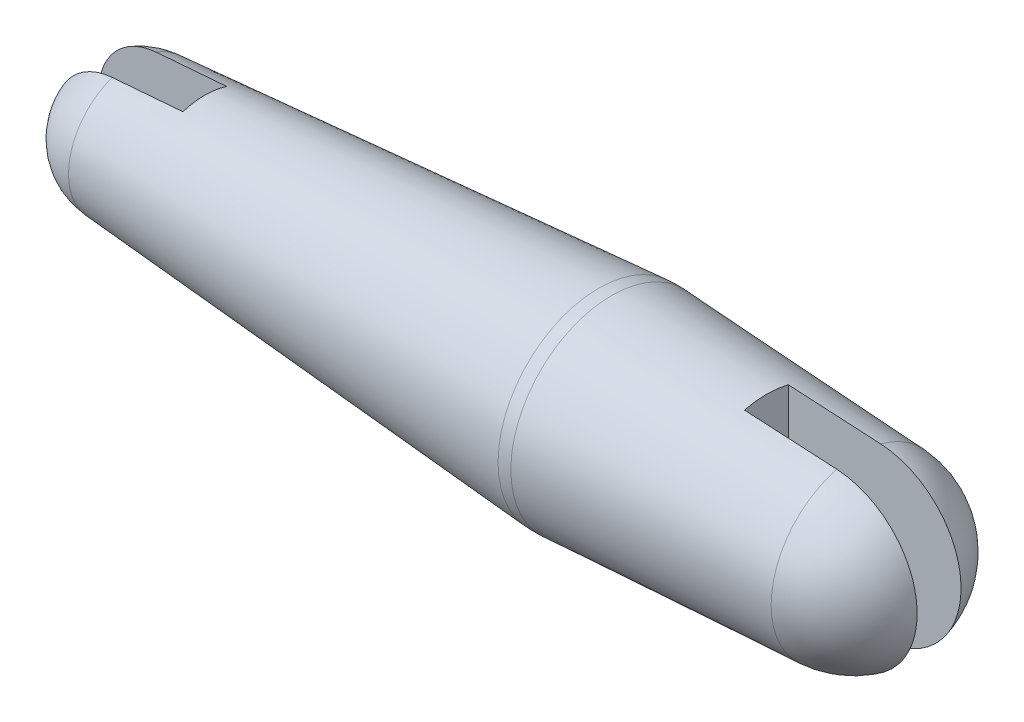
ISO-10303-21;
HEADER;
FILE_DESCRIPTION(('STEP AP214'),'2;1');
FILE_NAME('part.step','',(''),(''),'','','');
FILE_SCHEMA(('AUTOMOTIVE_DESIGN { 1 0 10303 214 1 1 1 1 }'));
ENDSEC;
DATA;
#1=APPLICATION_CONTEXT('core data for automotive mechanical design processes');
#2=APPLICATION_PROTOCOL_DEFINITION('international standard','automotive_design',2000,#1);
#3=PRODUCT_CONTEXT('',#1,'mechanical');
#4=PRODUCT('Part','Part','',(#3));
#5=PRODUCT_RELATED_PRODUCT_CATEGORY('part','',(#4));
#6=PRODUCT_DEFINITION_FORMATION('','',#4);
#7=PRODUCT_DEFINITION_CONTEXT('part definition',#1,'design');
#8=PRODUCT_DEFINITION('design','',#6,#7);
#9=PRODUCT_DEFINITION_SHAPE('','',#8);
#10=(LENGTH_UNIT() NAMED_UNIT(*) SI_UNIT(.MILLI.,.METRE.));
#11=(NAMED_UNIT(*) PLANE_ANGLE_UNIT() SI_UNIT($,.RADIAN.));
#12=(NAMED_UNIT(*) SI_UNIT($,.STERADIAN.) SOLID_ANGLE_UNIT());
#13=UNCERTAINTY_MEASURE_WITH_UNIT(LENGTH_MEASURE(1.E-05),#10,'distance_accuracy_value','');
#14=(GEOMETRIC_REPRESENTATION_CONTEXT(3) GLOBAL_UNCERTAINTY_ASSIGNED_CONTEXT((#13)) GLOBAL_UNIT_ASSIGNED_CONTEXT((#10,
#11,#12)) REPRESENTATION_CONTEXT('',''));
#15=CARTESIAN_POINT('',(0.,0.,0.));
#16=DIRECTION('',(0.,0.,1.));
#17=DIRECTION('',(1.,0.,0.));
#18=AXIS2_PLACEMENT_3D('',#15,#16,#17);
#19=CARTESIAN_POINT('',(-207.01,0.,0.));
#20=DIRECTION('',(-1.,0.,0.));
#21=DIRECTION('',(0.,1.,0.));
#22=AXIS2_PLACEMENT_3D('',#19,#20,#21);
#23=SPHERICAL_SURFACE('',#22,38.1);
#24=CARTESIAN_POINT('',(-209.871971830986,0.,0.));
#25=DIRECTION('',(-1.,0.,0.));
#26=DIRECTION('',(0.,0.,1.));
#27=AXIS2_PLACEMENT_3D('',#24,#25,#26);
#28=CIRCLE('',#27,37.9923560369536);
#29=CARTESIAN_POINT('',(-209.871971830986,-35.8068305947153,12.7));
#30=VERTEX_POINT('',#29);
#31=CARTESIAN_POINT('',(-209.871971830986,35.8068305947153,12.7));
#32=VERTEX_POINT('',#31);
#33=EDGE_CURVE('E217',#30,#32,#28,.T.);
#34=ORIENTED_EDGE('',*,*,#33,.T.);
#35=CARTESIAN_POINT('',(-207.01,0.,12.7));
#36=DIRECTION('',(0.,0.,1.));
#37=DIRECTION('',(1.,0.,0.));
#38=AXIS2_PLACEMENT_3D('',#35,#36,#37);
#39=CIRCLE('',#38,35.9210244842766);
#40=EDGE_CURVE('E243',#32,#30,#39,.T.);
#41=ORIENTED_EDGE('',*,*,#40,.T.);
#42=EDGE_LOOP('',(#34,#41));
#43=FACE_BOUND('',#42,.T.);
#44=ADVANCED_FACE('F32',(#43),#23,.T.);
#45=CARTESIAN_POINT('',(207.01,0.,0.));
#46=DIRECTION('',(-1.,0.,0.));
#47=DIRECTION('',(0.,1.,0.));
#48=AXIS2_PLACEMENT_3D('',#45,#46,#47);
#49=SPHERICAL_SURFACE('',#48,50.8);
#50=CARTESIAN_POINT('',(209.707345132743,0.,0.));
#51=DIRECTION('',(-1.,0.,0.));
#52=DIRECTION('',(0.,0.,1.));
#53=AXIS2_PLACEMENT_3D('',#50,#51,#52);
#54=CIRCLE('',#53,50.7283385223177);
#55=CARTESIAN_POINT('',(209.707345132743,-49.1128733555151,12.7));
#56=VERTEX_POINT('',#55);
#57=CARTESIAN_POINT('',(209.707345132743,49.1128733555151,12.7));
#58=VERTEX_POINT('',#57);
#59=EDGE_CURVE('E192',#56,#58,#54,.T.);
#60=ORIENTED_EDGE('',*,*,#59,.F.);
#61=CARTESIAN_POINT('',(207.01,0.,12.7));
#62=DIRECTION('',(0.,0.,1.));
#63=DIRECTION('',(1.,0.,0.));
#64=AXIS2_PLACEMENT_3D('',#61,#62,#63);
#65=CIRCLE('',#64,49.1868884968342);
#66=EDGE_CURVE('E222',#56,#58,#65,.T.);
#67=ORIENTED_EDGE('',*,*,#66,.T.);
#68=EDGE_LOOP('',(#60,#67));
#69=FACE_BOUND('',#68,.T.);
#70=ADVANCED_FACE('F202',(#69),#49,.T.);
#71=CARTESIAN_POINT('',(-209.871971830986,35.8068305947153,-12.7));
#72=VERTEX_POINT('',#71);
#73=CARTESIAN_POINT('',(-209.871971830986,-35.8068305947153,-12.7));
#74=VERTEX_POINT('',#73);
#75=EDGE_CURVE('E215',#72,#74,#28,.T.);
#76=ORIENTED_EDGE('',*,*,#75,.T.);
#77=CARTESIAN_POINT('',(-207.01,0.,-12.7));
#78=DIRECTION('',(0.,0.,-1.));
#79=DIRECTION('',(-1.,0.,0.));
#80=AXIS2_PLACEMENT_3D('',#77,#78,#79);
#81=CIRCLE('',#80,35.9210244842766);
#82=EDGE_CURVE('E103',#74,#72,#81,.T.);
#83=ORIENTED_EDGE('',*,*,#82,.T.);
#84=EDGE_LOOP('',(#76,#83));
#85=FACE_BOUND('',#84,.T.);
#86=ADVANCED_FACE('F34',(#85),#23,.T.);
#87=CARTESIAN_POINT('',(209.707345132743,49.1128733555151,-12.7));
#88=VERTEX_POINT('',#87);
#89=CARTESIAN_POINT('',(209.707345132743,-49.1128733555151,-12.7));
#90=VERTEX_POINT('',#89);
#91=EDGE_CURVE('E191',#88,#90,#54,.T.);
#92=ORIENTED_EDGE('',*,*,#91,.F.);
#93=CARTESIAN_POINT('',(207.01,0.,-12.7));
#94=DIRECTION('',(0.,0.,-1.));
#95=DIRECTION('',(-1.,0.,0.));
#96=AXIS2_PLACEMENT_3D('',#93,#94,#95);
#97=CIRCLE('',#96,49.1868884968342);
#98=EDGE_CURVE('E60',#88,#90,#97,.T.);
#99=ORIENTED_EDGE('',*,*,#98,.T.);
#100=EDGE_LOOP('',(#92,#99));
#101=FACE_BOUND('',#100,.T.);
#102=ADVANCED_FACE('F181',(#101),#49,.T.);
#103=CARTESIAN_POINT('',(209.707345132743,0.,0.));
#104=DIRECTION('',(-1.,0.,0.));
#105=DIRECTION('',(0.,0.,1.));
#106=AXIS2_PLACEMENT_3D('',#103,#104,#105);
#107=CONICAL_SURFACE('',#106,50.7283385223177,0.0531223266455674);
#108=CARTESIAN_POINT('',(66.6019469026549,0.,0.));
#109=DIRECTION('',(-1.,0.,0.));
#110=DIRECTION('',(0.,0.,1.));
#111=AXIS2_PLACEMENT_3D('',#108,#109,#110);
#112=CIRCLE('',#111,58.3375893006654);
#113=CARTESIAN_POINT('',(66.6019469026549,58.3375893006654,0.));
#114=VERTEX_POINT('',#113);
#115=EDGE_CURVE('E220',#114,#114,#112,.T.);
#116=ORIENTED_EDGE('',*,*,#115,.F.);
#117=EDGE_LOOP('',(#116));
#118=FACE_BOUND('',#117,.T.);
#119=CARTESIAN_POINT('',(156.21,0.,0.));
#120=DIRECTION('',(-1.,0.,0.));
#121=DIRECTION('',(0.,0.,1.));
#122=AXIS2_PLACEMENT_3D('',#119,#120,#121);
#123=CIRCLE('',#122,53.5729182525412);
#124=CARTESIAN_POINT('',(156.21,-52.0458218312811,-12.7));
#125=VERTEX_POINT('',#124);
#126=CARTESIAN_POINT('',(156.21,-52.0458218312811,12.7));
#127=VERTEX_POINT('',#126);
#128=EDGE_CURVE('E128',#125,#127,#123,.T.);
#129=ORIENTED_EDGE('',*,*,#128,.T.);
#130=CARTESIAN_POINT('',(69.800110732917,-56.7641803866309,12.7));
#131=CARTESIAN_POINT('',(86.5004748588714,-55.8542174459959,12.7));
#132=CARTESIAN_POINT('',(103.20078363598,-54.9432377577997,12.7));
#133=CARTESIAN_POINT('',(136.601268619219,-53.1188604331567,12.7));
#134=CARTESIAN_POINT('',(153.301444825353,-52.2054627967807,12.7));
#135=CARTESIAN_POINT('',(186.701643914222,-50.3758650615804,12.7));
#136=CARTESIAN_POINT('',(203.401666796955,-49.4596649627321,12.7));
#137=CARTESIAN_POINT('',(236.801529651166,-47.623928215632,12.7));
#138=CARTESIAN_POINT('',(253.50136962264,-46.7043915672824,12.7));
#139=CARTESIAN_POINT('',(270.201102926321,-45.7829196236566,12.7));
#140=B_SPLINE_CURVE_WITH_KNOTS('',3,(#130,#131,#132,#133,#134,#135,#136,#137,#138,#139),
.UNSPECIFIED.,.F.,.F.,(4,2,2,2,4),(0.,50.1754098598207,100.35081825112,150.526227072948,
200.701637366635),.UNSPECIFIED.);
#141=EDGE_CURVE('E126',#127,#56,#140,.T.);
#142=ORIENTED_EDGE('',*,*,#141,.T.);
#143=ORIENTED_EDGE('',*,*,#59,.T.);
#144=CARTESIAN_POINT('',(270.201102926321,45.7829196236566,12.7));
#145=CARTESIAN_POINT('',(255.185213815373,46.6114837468134,12.7));
#146=CARTESIAN_POINT('',(240.169238109705,47.4384774030686,12.7));
#147=CARTESIAN_POINT('',(210.137136037152,49.089721922005,12.7));
#148=CARTESIAN_POINT('',(195.121009670269,49.9139727847149,12.7));
#149=CARTESIAN_POINT('',(176.737064016111,50.9216472107724,12.7));
#150=CARTESIAN_POINT('',(173.369305721484,51.106184125453,12.7));
#151=CARTESIAN_POINT('',(153.301444729948,52.205464825698,12.7));
#152=CARTESIAN_POINT('',(136.601268227147,53.1188614663041,12.7));
#153=CARTESIAN_POINT('',(103.20078310973,54.9432367744029,12.7));
#154=CARTESIAN_POINT('',(86.5004744951131,55.8542154418912,12.7));
#155=CARTESIAN_POINT('',(69.800110732917,56.7641803866309,12.7));
#156=B_SPLINE_CURVE_WITH_KNOTS('',3,(#144,#145,#146,#147,#148,#149,#150,#151,#152,#153,#154,
#155),.UNSPECIFIED.,.F.,.F.,(4,2,2,2,2,4),(0.,45.1161942560222,90.2323880417603,
100.350819157314,150.526228238364,200.701637408434),.UNSPECIFIED.);
#157=CARTESIAN_POINT('',(156.21,52.0458218312811,12.7));
#158=VERTEX_POINT('',#157);
#159=EDGE_CURVE('E165',#58,#158,#156,.T.);
#160=ORIENTED_EDGE('',*,*,#159,.T.);
#161=CARTESIAN_POINT('',(156.21,52.0458218312811,-12.7));
#162=VERTEX_POINT('',#161);
#163=EDGE_CURVE('E172',#158,#162,#123,.T.);
#164=ORIENTED_EDGE('',*,*,#163,.T.);
#165=CARTESIAN_POINT('',(69.800110732917,56.7641803866309,-12.7));
#166=CARTESIAN_POINT('',(86.5004748588714,55.8542174459959,-12.7));
#167=CARTESIAN_POINT('',(103.20078363598,54.9432377577997,-12.7));
#168=CARTESIAN_POINT('',(136.601268619219,53.1188604331567,-12.7));
#169=CARTESIAN_POINT('',(153.301444825353,52.2054627967807,-12.7));
#170=CARTESIAN_POINT('',(186.701643914222,50.3758650615804,-12.7));
#171=CARTESIAN_POINT('',(203.401666796955,49.4596649627321,-12.7));
#172=CARTESIAN_POINT('',(236.801529651166,47.623928215632,-12.7));
#173=CARTESIAN_POINT('',(253.50136962264,46.7043915672824,-12.7));
#174=CARTESIAN_POINT('',(270.201102926321,45.7829196236566,-12.7));
#175=B_SPLINE_CURVE_WITH_KNOTS('',3,(#165,#166,#167,#168,#169,#170,#171,#172,#173,#174),
.UNSPECIFIED.,.F.,.F.,(4,2,2,2,4),(0.,50.1754098598207,100.35081825112,150.526227072948,
200.701637366635),.UNSPECIFIED.);
#176=EDGE_CURVE('E185',#162,#88,#175,.T.);
#177=ORIENTED_EDGE('',*,*,#176,.T.);
#178=ORIENTED_EDGE('',*,*,#91,.T.);
#179=CARTESIAN_POINT('',(270.201102926321,-45.7829196236566,-12.7));
#180=CARTESIAN_POINT('',(255.185213815373,-46.6114837468134,-12.7));
#181=CARTESIAN_POINT('',(240.169238109705,-47.4384774030686,-12.7));
#182=CARTESIAN_POINT('',(210.137136037152,-49.089721922005,-12.7));
#183=CARTESIAN_POINT('',(195.121009670269,-49.9139727847149,-12.7));
#184=CARTESIAN_POINT('',(176.737064016111,-50.9216472107724,-12.7));
#185=CARTESIAN_POINT('',(173.369305721484,-51.106184125453,-12.7));
#186=CARTESIAN_POINT('',(153.301444729948,-52.205464825698,-12.7));
#187=CARTESIAN_POINT('',(136.601268227147,-53.1188614663041,-12.7));
#188=CARTESIAN_POINT('',(103.20078310973,-54.9432367744029,-12.7));
#189=CARTESIAN_POINT('',(86.5004744951131,-55.8542154418912,-12.7));
#190=CARTESIAN_POINT('',(69.800110732917,-56.7641803866309,-12.7));
#191=B_SPLINE_CURVE_WITH_KNOTS('',3,(#179,#180,#181,#182,#183,#184,#185,#186,#187,#188,#189,
#190),.UNSPECIFIED.,.F.,.F.,(4,2,2,2,2,4),(0.,45.1161942560222,90.2323880417603,
100.350819157314,150.526228238364,200.701637408434),.UNSPECIFIED.);
#192=EDGE_CURVE('E171',#90,#125,#191,.T.);
#193=ORIENTED_EDGE('',*,*,#192,.T.);
#194=EDGE_LOOP('',(#129,#142,#143,#160,#164,#177,#178,#193));
#195=FACE_BOUND('',#194,.T.);
#196=ADVANCED_FACE('F177',(#118,#195),#107,.T.);
#197=CARTESIAN_POINT('',(63.5,0.,0.));
#198=DIRECTION('',(-1.,0.,0.));
#199=DIRECTION('',(0.,1.,0.));
#200=AXIS2_PLACEMENT_3D('',#197,#198,#199);
#201=SPHERICAL_SURFACE('',#200,58.42);
#202=CARTESIAN_POINT('',(59.1116431924883,0.,0.));
#203=DIRECTION('',(-1.,0.,0.));
#204=DIRECTION('',(0.,0.,1.));
#205=AXIS2_PLACEMENT_3D('',#202,#203,#204);
#206=CIRCLE('',#205,58.2549459233288);
#207=CARTESIAN_POINT('',(59.1116431924883,58.2549459233288,0.));
#208=VERTEX_POINT('',#207);
#209=EDGE_CURVE('E216',#208,#208,#206,.T.);
#210=CARTESIAN_POINT('',(59.1116431924883,58.2549459233288,0.));
#211=CARTESIAN_POINT('',(59.1895048845208,58.2608112611754,0.));
#212=CARTESIAN_POINT('',(59.2673783358122,58.2665204960912,0.));
#213=CARTESIAN_POINT('',(59.4231475046043,58.2776266722295,0.));
#214=CARTESIAN_POINT('',(59.501043222105,58.2830236134521,0.));
#215=CARTESIAN_POINT('',(59.6568556710072,58.2935051143726,0.));
#216=CARTESIAN_POINT('',(59.7347724024086,58.2985896740705,0.));
#217=CARTESIAN_POINT('',(59.89062562637,58.3084463304779,0.));
#218=CARTESIAN_POINT('',(59.9685621189299,58.3132184271874,0.));
#219=CARTESIAN_POINT('',(60.1244536121739,58.3224500808175,0.));
#220=CARTESIAN_POINT('',(60.2024086128579,58.3269096377381,0.));
#221=CARTESIAN_POINT('',(60.3583358690112,58.3355161401113,0.));
#222=CARTESIAN_POINT('',(60.4363081244806,58.3396630855639,0.));
#223=CARTESIAN_POINT('',(60.5922686365902,58.3476442983224,0.));
#224=CARTESIAN_POINT('',(60.6702568932305,58.3514785656282,0.));
#225=CARTESIAN_POINT('',(60.82624815381,58.3588343604484,0.));
#226=CARTESIAN_POINT('',(60.9042511577492,58.3623558879628,0.));
#227=CARTESIAN_POINT('',(61.0602706588172,58.3690861465814,0.));
#228=CARTESIAN_POINT('',(61.1382871559461,58.3722948776858,0.));
#229=CARTESIAN_POINT('',(61.2943323890677,58.3783994918956,0.));
#230=CARTESIAN_POINT('',(61.3723611250603,58.381295375001,0.));
#231=CARTESIAN_POINT('',(61.5284295813864,58.3867742466538,0.));
#232=CARTESIAN_POINT('',(61.6064693017199,58.3893572352012,0.));
#233=CARTESIAN_POINT('',(61.7625584720283,58.3942102762093,0.));
#234=CARTESIAN_POINT('',(61.8406079220033,58.3964803286701,0.));
#235=CARTESIAN_POINT('',(61.9967152967387,58.4007074610078,0.));
#236=CARTESIAN_POINT('',(62.0747732214993,58.4026645408847,0.));
#237=CARTESIAN_POINT('',(62.2308962908138,58.4062656965894,0.));
#238=CARTESIAN_POINT('',(62.3089614353678,58.4079097724172,0.));
#239=CARTESIAN_POINT('',(62.4650976891611,58.4108848935906,0.));
#240=CARTESIAN_POINT('',(62.5431687984004,58.4122159389362,0.));
#241=CARTESIAN_POINT('',(62.6993157263602,58.4145649777452,0.));
#242=CARTESIAN_POINT('',(62.7773915450807,58.4155829712085,0.));
#243=CARTESIAN_POINT('',(62.9335466367231,58.4173058898859,0.));
#244=CARTESIAN_POINT('',(63.0116259096449,58.4180108151,0.));
#245=CARTESIAN_POINT('',(63.1677866543547,58.4191075859452,0.));
#246=CARTESIAN_POINT('',(63.2458681261426,58.4194994315764,0.));
#247=CARTESIAN_POINT('',(63.4020320132138,58.419970036956,0.));
#248=CARTESIAN_POINT('',(63.4801144284971,58.4200487967043,0.));
#249=CARTESIAN_POINT('',(63.6362789471731,58.4198932290519,0.));
#250=CARTESIAN_POINT('',(63.7143610505658,58.4196589016512,0.));
#251=CARTESIAN_POINT('',(63.87052369008,58.418877163468,0.));
#252=CARTESIAN_POINT('',(63.9486042262013,58.4183297526855,0.));
#253=CARTESIAN_POINT('',(64.1047624758171,58.4169218565401,0.));
#254=CARTESIAN_POINT('',(64.1828401893114,58.4160613711771,0.));
#255=CARTESIAN_POINT('',(64.3389915383628,58.4140273397052,0.));
#256=CARTESIAN_POINT('',(64.4170651739199,58.4128537935963,0.));
#257=CARTESIAN_POINT('',(64.573207111852,58.4101936595004,0.));
#258=CARTESIAN_POINT('',(64.651275414227,58.4087070715135,0.));
#259=CARTESIAN_POINT('',(64.8074054306362,58.4054208775625,0.));
#260=CARTESIAN_POINT('',(64.8854671446703,58.4036212715984,0.));
#261=CARTESIAN_POINT('',(65.0415827293445,58.399709070627,0.));
#262=CARTESIAN_POINT('',(65.1196365999846,58.3975964756196,0.));
#263=CARTESIAN_POINT('',(65.2757352429438,58.3930583305259,0.));
#264=CARTESIAN_POINT('',(65.3537800152629,58.3906327804395,0.));
#265=CARTESIAN_POINT('',(65.5098592067997,58.3854687641904,0.));
#266=CARTESIAN_POINT('',(65.5878936260175,58.3827302980278,0.));
#267=CARTESIAN_POINT('',(65.7439508567364,58.3769404936339,0.));
#268=CARTESIAN_POINT('',(65.8219736682375,58.3738891554028,0.));
#269=CARTESIAN_POINT('',(65.9780064290994,58.3674736560068,0.));
#270=CARTESIAN_POINT('',(66.0560163784602,58.3641094948419,0.));
#271=CARTESIAN_POINT('',(66.2120221608065,58.3570684033818,0.));
#272=CARTESIAN_POINT('',(66.2900179937921,58.3533914730866,0.));
#273=CARTESIAN_POINT('',(66.4459942894465,58.3457249035447,0.));
#274=CARTESIAN_POINT('',(66.5239747521153,58.3417352642981,0.));
#275=CARTESIAN_POINT('',(66.6019469026549,58.3375893006654,0.));
#276=B_SPLINE_CURVE_WITH_KNOTS('',3,(#210,#211,#212,#213,#214,#215,#216,#217,#218,#219,#220,
#221,#222,#223,#224,#225,#226,#227,#228,#229,#230,#231,#232,#233,#234,#235,#236,#237,#238,#239,
#240,#241,#242,#243,#244,#245,#246,#247,#248,#249,#250,#251,#252,#253,#254,#255,#256,#257,#258,
#259,#260,#261,#262,#263,#264,#265,#266,#267,#268,#269,#270,#271,#272,#273,#274,#275),
.UNSPECIFIED.,.F.,.F.,(4,2,2,2,2,2,2,2,2,2,2,2,2,2,2,2,2,2,2,2,2,2,2,2,2,2,2,2,2,2,2,2,4),(0.,
0.234246737320947,0.468493474641886,0.702740211962827,0.936986949283774,1.17123368660471,
1.40548042392566,1.6397271612466,1.87397389856754,2.10822063588848,2.34246737320942,
2.57671411053037,2.81096084785131,3.04520758517225,3.27945432249319,3.51370105981414,
3.74794779713508,3.98219453445602,4.21644127177696,4.4506880090979,4.68493474641885,
4.91918148373979,5.15342822106073,5.38767495838167,5.62192169570261,5.85616843302356,
6.0904151703445,6.32466190766544,6.55890864498639,6.79315538230733,7.02740211962827,
7.26164885694921,7.49589559427016),.UNSPECIFIED.);
#277=EDGE_CURVE('BSEAM180',#208,#114,#276,.T.);
#278=ORIENTED_EDGE('',*,*,#209,.F.);
#279=ORIENTED_EDGE('',*,*,#115,.T.);
#280=ORIENTED_EDGE('',*,*,#277,.T.);
#281=ORIENTED_EDGE('',*,*,#277,.F.);
#282=EDGE_LOOP('',(#278,#280,#279,#281));
#283=FACE_BOUND('',#282,.T.);
#284=ADVANCED_FACE('F180',(#283),#201,.T.);
#285=CARTESIAN_POINT('',(59.1116431924883,0.,0.));
#286=DIRECTION('',(1.,0.,0.));
#287=DIRECTION('',(0.,0.,-1.));
#288=AXIS2_PLACEMENT_3D('',#285,#286,#287);
#289=CONICAL_SURFACE('',#288,58.2549459233288,0.0751881939948257);
#290=ORIENTED_EDGE('',*,*,#33,.F.);
#291=CARTESIAN_POINT('',(-271.035918490705,-30.8748946363177,12.7));
#292=CARTESIAN_POINT('',(-265.87761606271,-31.2950538919385,12.7));
#293=CARTESIAN_POINT('',(-260.719214395599,-31.7139927004372,12.7));
#294=CARTESIAN_POINT('',(-250.40223369455,-32.5496787727329,12.7));
#295=CARTESIAN_POINT('',(-245.243654660617,-32.9664260366009,12.7));
#296=CARTESIAN_POINT('',(-229.767684748398,-34.2137544090888,12.7));
#297=CARTESIAN_POINT('',(-219.450058985421,-35.041422267346,12.7));
#298=CARTESIAN_POINT('',(-205.781744951044,-36.1336987378958,12.7));
#299=CARTESIAN_POINT('',(-202.431280419172,-36.4011118477096,12.7));
#300=CARTESIAN_POINT('',(-187.087514928632,-37.6243295143696,12.7));
#301=CARTESIAN_POINT('',(-175.093922421213,-38.5764797534287,12.7));
#302=CARTESIAN_POINT('',(-157.103158968315,-39.9999633845212,12.7));
#303=CARTESIAN_POINT('',(-151.106175344977,-40.4736676421686,12.7));
#304=CARTESIAN_POINT('',(-139.11209542084,-41.4196448597445,12.7));
#305=CARTESIAN_POINT('',(-133.114999120044,-41.891917819724,12.7));
#306=CARTESIAN_POINT('',(-127.117852368377,-42.3635497874705,12.7));
#307=B_SPLINE_CURVE_WITH_KNOTS('',3,(#291,#292,#293,#294,#295,#296,#297,#298,#299,#300,#301,
#302,#303,#304,#305,#306),.UNSPECIFIED.,.F.,.F.,(4,2,2,2,2,2,2,4),(0.,15.5261568543084,
31.0523132052768,62.1046196638545,72.1879772986251,108.281958294165,126.328948934836,
144.375938931133),.UNSPECIFIED.);
#308=CARTESIAN_POINT('',(-168.91,-39.0655157110014,12.7));
#309=VERTEX_POINT('',#308);
#310=EDGE_CURVE('E11',#30,#309,#307,.T.);
#311=ORIENTED_EDGE('',*,*,#310,.T.);
#312=CARTESIAN_POINT('',(-168.91,0.,0.));
#313=DIRECTION('',(1.,0.,0.));
#314=DIRECTION('',(0.,0.,-1.));
#315=AXIS2_PLACEMENT_3D('',#312,#313,#314);
#316=CIRCLE('',#315,41.0780296237112);
#317=CARTESIAN_POINT('',(-168.91,-39.0655157110014,-12.7));
#318=VERTEX_POINT('',#317);
#319=EDGE_CURVE('E45',#309,#318,#316,.T.);
#320=ORIENTED_EDGE('',*,*,#319,.T.);
#321=CARTESIAN_POINT('',(-127.117852368377,-42.3635497874705,-12.7));
#322=CARTESIAN_POINT('',(-133.11500061625,-41.8919176028191,-12.7));
#323=CARTESIAN_POINT('',(-139.112098437743,-41.4196445725496,-12.7));
#324=CARTESIAN_POINT('',(-151.10618127784,-40.4736672234911,-12.7));
#325=CARTESIAN_POINT('',(-157.103166296443,-39.999962904681,-12.7));
#326=CARTESIAN_POINT('',(-175.09392818762,-38.5764790969215,-12.7));
#327=CARTESIAN_POINT('',(-187.087517664637,-37.6243283032366,-12.7));
#328=CARTESIAN_POINT('',(-205.077429327357,-36.1901591661927,-12.7));
#329=CARTESIAN_POINT('',(-211.073988463649,-35.711112241897,-12.7));
#330=CARTESIAN_POINT('',(-223.06692716061,-34.7507764249438,-12.7));
#331=CARTESIAN_POINT('',(-229.063306721282,-34.2694875323221,-12.7));
#332=CARTESIAN_POINT('',(-241.055864680896,-33.3043747454579,-12.7));
#333=CARTESIAN_POINT('',(-247.052043079745,-32.8205508500489,-12.7));
#334=CARTESIAN_POINT('',(-259.044164929191,-31.8499960464844,-12.7));
#335=CARTESIAN_POINT('',(-265.040108379773,-31.3632651381582,-12.7));
#336=CARTESIAN_POINT('',(-271.035918490705,-30.8748946363177,-12.7));
#337=B_SPLINE_CURVE_WITH_KNOTS('',3,(#321,#322,#323,#324,#325,#326,#327,#328,#329,#330,#331,
#332,#333,#334,#335,#336),.UNSPECIFIED.,.F.,.F.,(4,2,2,2,2,2,2,4),(0.,18.0469945479574,
36.0939893630042,72.1879616325076,90.2349518254261,108.281941729949,126.32893993987,
144.375939209583),.UNSPECIFIED.);
#338=EDGE_CURVE('E100',#318,#74,#337,.T.);
#339=ORIENTED_EDGE('',*,*,#338,.T.);
#340=ORIENTED_EDGE('',*,*,#75,.F.);
#341=CARTESIAN_POINT('',(-271.035918490705,30.8748946363177,-12.7));
#342=CARTESIAN_POINT('',(-265.87761606271,31.2950538919385,-12.7));
#343=CARTESIAN_POINT('',(-260.719214395599,31.7139927004372,-12.7));
#344=CARTESIAN_POINT('',(-250.40223369455,32.5496787727329,-12.7));
#345=CARTESIAN_POINT('',(-245.243654660617,32.9664260366009,-12.7));
#346=CARTESIAN_POINT('',(-229.767684748398,34.2137544090888,-12.7));
#347=CARTESIAN_POINT('',(-219.450058985421,35.041422267346,-12.7));
#348=CARTESIAN_POINT('',(-205.781744951044,36.1336987378958,-12.7));
#349=CARTESIAN_POINT('',(-202.431280419172,36.4011118477096,-12.7));
#350=CARTESIAN_POINT('',(-187.087514928632,37.6243295143696,-12.7));
#351=CARTESIAN_POINT('',(-175.093922421213,38.5764797534288,-12.7));
#352=CARTESIAN_POINT('',(-157.103158968315,39.9999633845212,-12.7));
#353=CARTESIAN_POINT('',(-151.106175344977,40.4736676421686,-12.7));
#354=CARTESIAN_POINT('',(-139.11209542084,41.4196448597445,-12.7));
#355=CARTESIAN_POINT('',(-133.114999120044,41.891917819724,-12.7));
#356=CARTESIAN_POINT('',(-127.117852368377,42.3635497874705,-12.7));
#357=B_SPLINE_CURVE_WITH_KNOTS('',3,(#341,#342,#343,#344,#345,#346,#347,#348,#349,#350,#351,
#352,#353,#354,#355,#356),.UNSPECIFIED.,.F.,.F.,(4,2,2,2,2,2,2,4),(0.,15.5261568543083,
31.0523132052768,62.1046196638545,72.1879772986251,108.281958294165,126.328948934836,
144.375938931133),.UNSPECIFIED.);
#358=CARTESIAN_POINT('',(-168.91,39.0655157110014,-12.7));
#359=VERTEX_POINT('',#358);
#360=EDGE_CURVE('E124',#72,#359,#357,.T.);
#361=ORIENTED_EDGE('',*,*,#360,.T.);
#362=CARTESIAN_POINT('',(-168.91,39.0655157110014,12.7));
#363=VERTEX_POINT('',#362);
#364=EDGE_CURVE('E114',#359,#363,#316,.T.);
#365=ORIENTED_EDGE('',*,*,#364,.T.);
#366=CARTESIAN_POINT('',(-127.117852368377,42.3635497874705,12.7));
#367=CARTESIAN_POINT('',(-133.11500061625,41.8919176028191,12.7));
#368=CARTESIAN_POINT('',(-139.112098437743,41.4196445725496,12.7));
#369=CARTESIAN_POINT('',(-151.10618127784,40.4736672234911,12.7));
#370=CARTESIAN_POINT('',(-157.103166296443,39.999962904681,12.7));
#371=CARTESIAN_POINT('',(-175.09392818762,38.5764790969214,12.7));
#372=CARTESIAN_POINT('',(-187.087517664637,37.6243283032366,12.7));
#373=CARTESIAN_POINT('',(-205.077429327357,36.1901591661927,12.7));
#374=CARTESIAN_POINT('',(-211.073988463649,35.711112241897,12.7));
#375=CARTESIAN_POINT('',(-223.06692716061,34.7507764249438,12.7));
#376=CARTESIAN_POINT('',(-229.063306721282,34.2694875323221,12.7));
#377=CARTESIAN_POINT('',(-241.055864680896,33.3043747454579,12.7));
#378=CARTESIAN_POINT('',(-247.052043079745,32.8205508500489,12.7));
#379=CARTESIAN_POINT('',(-259.044164929191,31.8499960464844,12.7));
#380=CARTESIAN_POINT('',(-265.040108379773,31.3632651381582,12.7));
#381=CARTESIAN_POINT('',(-271.035918490705,30.8748946363177,12.7));
#382=B_SPLINE_CURVE_WITH_KNOTS('',3,(#366,#367,#368,#369,#370,#371,#372,#373,#374,#375,#376,
#377,#378,#379,#380,#381),.UNSPECIFIED.,.F.,.F.,(4,2,2,2,2,2,2,4),(0.,18.0469945479574,
36.0939893630042,72.1879616325076,90.2349518254261,108.281941729949,126.32893993987,
144.375939209583),.UNSPECIFIED.);
#383=EDGE_CURVE('E108',#363,#32,#382,.T.);
#384=ORIENTED_EDGE('',*,*,#383,.T.);
#385=EDGE_LOOP('',(#290,#311,#320,#339,#340,#361,#365,#384));
#386=FACE_BOUND('',#385,.T.);
#387=ORIENTED_EDGE('',*,*,#209,.T.);
#388=EDGE_LOOP('',(#387));
#389=FACE_BOUND('',#388,.T.);
#390=ADVANCED_FACE('F119',(#386,#389),#289,.T.);
#391=CARTESIAN_POINT('',(156.21,-58.42,12.7));
#392=DIRECTION('',(0.,0.,1.));
#393=DIRECTION('',(1.,0.,0.));
#394=AXIS2_PLACEMENT_3D('',#391,#392,#393);
#395=PLANE('',#394);
#396=DIRECTION('',(0.,1.,0.));
#397=VECTOR('',#396,1.);
#398=CARTESIAN_POINT('',(156.21,-58.42,12.7));
#399=LINE('',#398,#397);
#400=EDGE_CURVE('E236',#127,#158,#399,.T.);
#401=ORIENTED_EDGE('',*,*,#400,.T.);
#402=ORIENTED_EDGE('',*,*,#159,.F.);
#403=ORIENTED_EDGE('',*,*,#66,.F.);
#404=ORIENTED_EDGE('',*,*,#141,.F.);
#405=EDGE_LOOP('',(#401,#402,#403,#404));
#406=FACE_BOUND('',#405,.T.);
#407=ADVANCED_FACE('F157',(#406),#395,.F.);
#408=CARTESIAN_POINT('',(156.21,-58.42,-12.7));
#409=DIRECTION('',(-1.,0.,0.));
#410=DIRECTION('',(0.,0.,1.));
#411=AXIS2_PLACEMENT_3D('',#408,#409,#410);
#412=PLANE('',#411);
#413=ORIENTED_EDGE('',*,*,#400,.F.);
#414=ORIENTED_EDGE('',*,*,#128,.F.);
#415=DIRECTION('',(0.,1.,0.));
#416=VECTOR('',#415,1.);
#417=CARTESIAN_POINT('',(156.21,-58.42,-12.7));
#418=LINE('',#417,#416);
#419=EDGE_CURVE('E239',#125,#162,#418,.T.);
#420=ORIENTED_EDGE('',*,*,#419,.T.);
#421=ORIENTED_EDGE('',*,*,#163,.F.);
#422=EDGE_LOOP('',(#413,#414,#420,#421));
#423=FACE_BOUND('',#422,.T.);
#424=ADVANCED_FACE('F161',(#423),#412,.F.);
#425=CARTESIAN_POINT('',(156.21,-58.42,-12.7));
#426=DIRECTION('',(0.,0.,-1.));
#427=DIRECTION('',(-1.,0.,0.));
#428=AXIS2_PLACEMENT_3D('',#425,#426,#427);
#429=PLANE('',#428);
#430=ORIENTED_EDGE('',*,*,#98,.F.);
#431=ORIENTED_EDGE('',*,*,#176,.F.);
#432=ORIENTED_EDGE('',*,*,#419,.F.);
#433=ORIENTED_EDGE('',*,*,#192,.F.);
#434=EDGE_LOOP('',(#430,#431,#432,#433));
#435=FACE_BOUND('',#434,.T.);
#436=ADVANCED_FACE('F156',(#435),#429,.F.);
#437=CARTESIAN_POINT('',(-168.91,-58.42,-12.7));
#438=DIRECTION('',(1.,0.,0.));
#439=DIRECTION('',(0.,0.,-1.));
#440=AXIS2_PLACEMENT_3D('',#437,#438,#439);
#441=PLANE('',#440);
#442=DIRECTION('',(0.,1.,0.));
#443=VECTOR('',#442,1.);
#444=CARTESIAN_POINT('',(-168.91,-58.42,-12.7));
#445=LINE('',#444,#443);
#446=EDGE_CURVE('E52',#318,#359,#445,.T.);
#447=ORIENTED_EDGE('',*,*,#446,.F.);
#448=ORIENTED_EDGE('',*,*,#319,.F.);
#449=DIRECTION('',(0.,1.,0.));
#450=VECTOR('',#449,1.);
#451=CARTESIAN_POINT('',(-168.91,-58.42,12.7));
#452=LINE('',#451,#450);
#453=EDGE_CURVE('E116',#309,#363,#452,.T.);
#454=ORIENTED_EDGE('',*,*,#453,.T.);
#455=ORIENTED_EDGE('',*,*,#364,.F.);
#456=EDGE_LOOP('',(#447,#448,#454,#455));
#457=FACE_BOUND('',#456,.T.);
#458=ADVANCED_FACE('F110',(#457),#441,.F.);
#459=CARTESIAN_POINT('',(-245.11,-58.42,12.7));
#460=DIRECTION('',(0.,0.,1.));
#461=DIRECTION('',(1.,0.,0.));
#462=AXIS2_PLACEMENT_3D('',#459,#460,#461);
#463=PLANE('',#462);
#464=ORIENTED_EDGE('',*,*,#40,.F.);
#465=ORIENTED_EDGE('',*,*,#383,.F.);
#466=ORIENTED_EDGE('',*,*,#453,.F.);
#467=ORIENTED_EDGE('',*,*,#310,.F.);
#468=EDGE_LOOP('',(#464,#465,#466,#467));
#469=FACE_BOUND('',#468,.T.);
#470=ADVANCED_FACE('F146',(#469),#463,.F.);
#471=CARTESIAN_POINT('',(-245.11,-58.42,-12.7));
#472=DIRECTION('',(0.,0.,-1.));
#473=DIRECTION('',(-1.,0.,0.));
#474=AXIS2_PLACEMENT_3D('',#471,#472,#473);
#475=PLANE('',#474);
#476=ORIENTED_EDGE('',*,*,#446,.T.);
#477=ORIENTED_EDGE('',*,*,#360,.F.);
#478=ORIENTED_EDGE('',*,*,#82,.F.);
#479=ORIENTED_EDGE('',*,*,#338,.F.);
#480=EDGE_LOOP('',(#476,#477,#478,#479));
#481=FACE_BOUND('',#480,.T.);
#482=ADVANCED_FACE('F101',(#481),#475,.F.);
#483=CLOSED_SHELL('',(#44,#70,#86,#102,#196,#284,#390,#407,#424,#436,#458,#470,#482));
#484=MANIFOLD_SOLID_BREP('B2',#483);
#485=ADVANCED_BREP_SHAPE_REPRESENTATION('',(#18,#484),#14);
#486=SHAPE_DEFINITION_REPRESENTATION(#9,#485);
ENDSEC;
END-ISO-10303-21;
